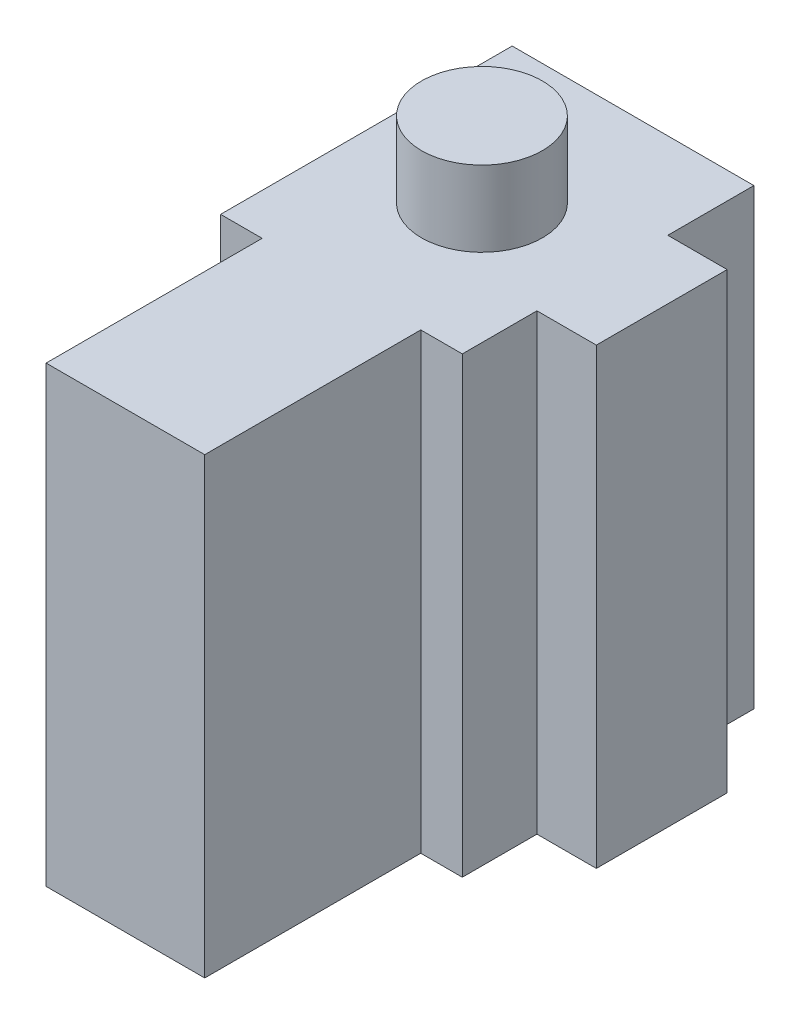
ISO-10303-21;
HEADER;
FILE_DESCRIPTION(('STEP AP214'),'2;1');
FILE_NAME('part.step','',(''),(''),'','','');
FILE_SCHEMA(('AUTOMOTIVE_DESIGN { 1 0 10303 214 1 1 1 1 }'));
ENDSEC;
DATA;
#1=APPLICATION_CONTEXT('core data for automotive mechanical design processes');
#2=APPLICATION_PROTOCOL_DEFINITION('international standard','automotive_design',2000,#1);
#3=PRODUCT_CONTEXT('',#1,'mechanical');
#4=PRODUCT('Part','Part','',(#3));
#5=PRODUCT_RELATED_PRODUCT_CATEGORY('part','',(#4));
#6=PRODUCT_DEFINITION_FORMATION('','',#4);
#7=PRODUCT_DEFINITION_CONTEXT('part definition',#1,'design');
#8=PRODUCT_DEFINITION('design','',#6,#7);
#9=PRODUCT_DEFINITION_SHAPE('','',#8);
#10=(LENGTH_UNIT() NAMED_UNIT(*) SI_UNIT(.MILLI.,.METRE.));
#11=(NAMED_UNIT(*) PLANE_ANGLE_UNIT() SI_UNIT($,.RADIAN.));
#12=(NAMED_UNIT(*) SI_UNIT($,.STERADIAN.) SOLID_ANGLE_UNIT());
#13=UNCERTAINTY_MEASURE_WITH_UNIT(LENGTH_MEASURE(1.E-05),#10,'distance_accuracy_value','');
#14=(GEOMETRIC_REPRESENTATION_CONTEXT(3) GLOBAL_UNCERTAINTY_ASSIGNED_CONTEXT((#13)) GLOBAL_UNIT_ASSIGNED_CONTEXT((#10,
#11,#12)) REPRESENTATION_CONTEXT('',''));
#15=CARTESIAN_POINT('',(0.,0.,0.));
#16=DIRECTION('',(0.,0.,1.));
#17=DIRECTION('',(1.,0.,0.));
#18=AXIS2_PLACEMENT_3D('',#15,#16,#17);
#19=CARTESIAN_POINT('',(0.,7.62,0.));
#20=DIRECTION('',(-1.,0.,0.));
#21=DIRECTION('',(0.,0.,1.));
#22=AXIS2_PLACEMENT_3D('',#19,#20,#21);
#23=PLANE('',#22);
#24=DIRECTION('',(0.,0.,-1.));
#25=VECTOR('',#24,1.);
#26=CARTESIAN_POINT('',(0.,0.,0.));
#27=LINE('',#26,#25);
#28=CARTESIAN_POINT('',(0.,0.,1.95115935074606));
#29=VERTEX_POINT('',#28);
#30=CARTESIAN_POINT('',(0.,0.,-1.68104064925394));
#31=VERTEX_POINT('',#30);
#32=EDGE_CURVE('E155',#29,#31,#27,.T.);
#33=ORIENTED_EDGE('',*,*,#32,.F.);
#34=DIRECTION('',(0.,-1.,0.));
#35=VECTOR('',#34,1.);
#36=CARTESIAN_POINT('',(0.,7.62,1.95115935074606));
#37=LINE('',#36,#35);
#38=CARTESIAN_POINT('',(0.,7.62,1.95115935074606));
#39=VERTEX_POINT('',#38);
#40=EDGE_CURVE('E11',#39,#29,#37,.T.);
#41=ORIENTED_EDGE('',*,*,#40,.F.);
#42=DIRECTION('',(0.,0.,-1.));
#43=VECTOR('',#42,1.);
#44=CARTESIAN_POINT('',(0.,7.62,0.));
#45=LINE('',#44,#43);
#46=CARTESIAN_POINT('',(0.,7.62,-1.68104064925394));
#47=VERTEX_POINT('',#46);
#48=EDGE_CURVE('E188',#39,#47,#45,.T.);
#49=ORIENTED_EDGE('',*,*,#48,.T.);
#50=DIRECTION('',(0.,-1.,0.));
#51=VECTOR('',#50,1.);
#52=CARTESIAN_POINT('',(0.,7.62,-1.68104064925394));
#53=LINE('',#52,#51);
#54=EDGE_CURVE('E54',#47,#31,#53,.T.);
#55=ORIENTED_EDGE('',*,*,#54,.T.);
#56=EDGE_LOOP('',(#33,#41,#49,#55));
#57=FACE_BOUND('',#56,.T.);
#58=ADVANCED_FACE('F38',(#57),#23,.T.);
#59=CARTESIAN_POINT('',(0.,7.62,1.95115935074606));
#60=DIRECTION('',(0.,0.,1.));
#61=DIRECTION('',(1.,0.,0.));
#62=AXIS2_PLACEMENT_3D('',#59,#60,#61);
#63=PLANE('',#62);
#64=DIRECTION('',(-1.,0.,0.));
#65=VECTOR('',#64,1.);
#66=CARTESIAN_POINT('',(0.,0.,1.95115935074606));
#67=LINE('',#66,#65);
#68=CARTESIAN_POINT('',(2.667,0.,1.95115935074606));
#69=VERTEX_POINT('',#68);
#70=EDGE_CURVE('E157',#69,#29,#67,.T.);
#71=ORIENTED_EDGE('',*,*,#70,.F.);
#72=DIRECTION('',(0.,-1.,0.));
#73=VECTOR('',#72,1.);
#74=CARTESIAN_POINT('',(2.667,7.62,1.95115935074606));
#75=LINE('',#74,#73);
#76=CARTESIAN_POINT('',(2.667,7.62,1.95115935074606));
#77=VERTEX_POINT('',#76);
#78=EDGE_CURVE('E46',#77,#69,#75,.T.);
#79=ORIENTED_EDGE('',*,*,#78,.F.);
#80=DIRECTION('',(-1.,0.,0.));
#81=VECTOR('',#80,1.);
#82=CARTESIAN_POINT('',(0.,7.62,1.95115935074606));
#83=LINE('',#82,#81);
#84=EDGE_CURVE('E225',#77,#39,#83,.T.);
#85=ORIENTED_EDGE('',*,*,#84,.T.);
#86=ORIENTED_EDGE('',*,*,#40,.T.);
#87=EDGE_LOOP('',(#71,#79,#85,#86));
#88=FACE_BOUND('',#87,.T.);
#89=ADVANCED_FACE('F213',(#88),#63,.T.);
#90=CARTESIAN_POINT('',(2.667,7.62,0.));
#91=DIRECTION('',(1.,0.,0.));
#92=DIRECTION('',(0.,0.,-1.));
#93=AXIS2_PLACEMENT_3D('',#90,#91,#92);
#94=PLANE('',#93);
#95=DIRECTION('',(0.,0.,1.));
#96=VECTOR('',#95,1.);
#97=CARTESIAN_POINT('',(2.667,0.,0.));
#98=LINE('',#97,#96);
#99=CARTESIAN_POINT('',(2.667,0.,-1.68104064925394));
#100=VERTEX_POINT('',#99);
#101=EDGE_CURVE('E161',#100,#69,#98,.T.);
#102=ORIENTED_EDGE('',*,*,#101,.F.);
#103=DIRECTION('',(0.,-1.,0.));
#104=VECTOR('',#103,1.);
#105=CARTESIAN_POINT('',(2.667,7.62,-1.68104064925394));
#106=LINE('',#105,#104);
#107=CARTESIAN_POINT('',(2.667,7.62,-1.68104064925394));
#108=VERTEX_POINT('',#107);
#109=EDGE_CURVE('E202',#108,#100,#106,.T.);
#110=ORIENTED_EDGE('',*,*,#109,.F.);
#111=DIRECTION('',(0.,0.,1.));
#112=VECTOR('',#111,1.);
#113=CARTESIAN_POINT('',(2.667,7.62,0.));
#114=LINE('',#113,#112);
#115=EDGE_CURVE('E209',#108,#77,#114,.T.);
#116=ORIENTED_EDGE('',*,*,#115,.T.);
#117=ORIENTED_EDGE('',*,*,#78,.T.);
#118=EDGE_LOOP('',(#102,#110,#116,#117));
#119=FACE_BOUND('',#118,.T.);
#120=ADVANCED_FACE('F207',(#119),#94,.T.);
#121=CARTESIAN_POINT('',(0.,7.62,-1.68104064925394));
#122=DIRECTION('',(0.,0.,1.));
#123=DIRECTION('',(1.,0.,0.));
#124=AXIS2_PLACEMENT_3D('',#121,#122,#123);
#125=PLANE('',#124);
#126=DIRECTION('',(-1.,0.,0.));
#127=VECTOR('',#126,1.);
#128=CARTESIAN_POINT('',(0.,0.,-1.68104064925394));
#129=LINE('',#128,#127);
#130=CARTESIAN_POINT('',(3.3655,0.,-1.68104064925394));
#131=VERTEX_POINT('',#130);
#132=EDGE_CURVE('E164',#131,#100,#129,.T.);
#133=ORIENTED_EDGE('',*,*,#132,.F.);
#134=DIRECTION('',(0.,-1.,0.));
#135=VECTOR('',#134,1.);
#136=CARTESIAN_POINT('',(3.3655,7.62,-1.68104064925394));
#137=LINE('',#136,#135);
#138=CARTESIAN_POINT('',(3.3655,7.62,-1.68104064925394));
#139=VERTEX_POINT('',#138);
#140=EDGE_CURVE('E200',#139,#131,#137,.T.);
#141=ORIENTED_EDGE('',*,*,#140,.F.);
#142=DIRECTION('',(-1.,0.,0.));
#143=VECTOR('',#142,1.);
#144=CARTESIAN_POINT('',(0.,7.62,-1.68104064925394));
#145=LINE('',#144,#143);
#146=EDGE_CURVE('E222',#139,#108,#145,.T.);
#147=ORIENTED_EDGE('',*,*,#146,.T.);
#148=ORIENTED_EDGE('',*,*,#109,.T.);
#149=EDGE_LOOP('',(#133,#141,#147,#148));
#150=FACE_BOUND('',#149,.T.);
#151=ADVANCED_FACE('F219',(#150),#125,.T.);
#152=CARTESIAN_POINT('',(3.3655,7.62,0.));
#153=DIRECTION('',(1.,0.,0.));
#154=DIRECTION('',(0.,0.,-1.));
#155=AXIS2_PLACEMENT_3D('',#152,#153,#154);
#156=PLANE('',#155);
#157=DIRECTION('',(0.,0.,1.));
#158=VECTOR('',#157,1.);
#159=CARTESIAN_POINT('',(3.3655,0.,0.));
#160=LINE('',#159,#158);
#161=CARTESIAN_POINT('',(3.3655,0.,-2.93580064925394));
#162=VERTEX_POINT('',#161);
#163=EDGE_CURVE('E167',#162,#131,#160,.T.);
#164=ORIENTED_EDGE('',*,*,#163,.F.);
#165=DIRECTION('',(0.,-1.,0.));
#166=VECTOR('',#165,1.);
#167=CARTESIAN_POINT('',(3.3655,7.62,-2.93580064925394));
#168=LINE('',#167,#166);
#169=CARTESIAN_POINT('',(3.3655,7.62,-2.93580064925394));
#170=VERTEX_POINT('',#169);
#171=EDGE_CURVE('E198',#170,#162,#168,.T.);
#172=ORIENTED_EDGE('',*,*,#171,.F.);
#173=DIRECTION('',(0.,0.,1.));
#174=VECTOR('',#173,1.);
#175=CARTESIAN_POINT('',(3.3655,7.62,0.));
#176=LINE('',#175,#174);
#177=EDGE_CURVE('E227',#170,#139,#176,.T.);
#178=ORIENTED_EDGE('',*,*,#177,.T.);
#179=ORIENTED_EDGE('',*,*,#140,.T.);
#180=EDGE_LOOP('',(#164,#172,#178,#179));
#181=FACE_BOUND('',#180,.T.);
#182=ADVANCED_FACE('F267',(#181),#156,.T.);
#183=CARTESIAN_POINT('',(0.,7.62,-2.93580064925393));
#184=DIRECTION('',(0.,0.,1.));
#185=DIRECTION('',(1.,0.,0.));
#186=AXIS2_PLACEMENT_3D('',#183,#184,#185);
#187=PLANE('',#186);
#188=DIRECTION('',(-1.,0.,0.));
#189=VECTOR('',#188,1.);
#190=CARTESIAN_POINT('',(0.,0.,-2.93580064925393));
#191=LINE('',#190,#189);
#192=CARTESIAN_POINT('',(4.36372,0.,-2.93580064925394));
#193=VERTEX_POINT('',#192);
#194=EDGE_CURVE('E170',#193,#162,#191,.T.);
#195=ORIENTED_EDGE('',*,*,#194,.F.);
#196=DIRECTION('',(0.,-1.,0.));
#197=VECTOR('',#196,1.);
#198=CARTESIAN_POINT('',(4.36372,7.62,-2.93580064925394));
#199=LINE('',#198,#197);
#200=CARTESIAN_POINT('',(4.36372,7.62,-2.93580064925394));
#201=VERTEX_POINT('',#200);
#202=EDGE_CURVE('E196',#201,#193,#199,.T.);
#203=ORIENTED_EDGE('',*,*,#202,.F.);
#204=DIRECTION('',(-1.,0.,0.));
#205=VECTOR('',#204,1.);
#206=CARTESIAN_POINT('',(0.,7.62,-2.93580064925393));
#207=LINE('',#206,#205);
#208=EDGE_CURVE('E233',#201,#170,#207,.T.);
#209=ORIENTED_EDGE('',*,*,#208,.T.);
#210=ORIENTED_EDGE('',*,*,#171,.T.);
#211=EDGE_LOOP('',(#195,#203,#209,#210));
#212=FACE_BOUND('',#211,.T.);
#213=ADVANCED_FACE('F270',(#212),#187,.T.);
#214=CARTESIAN_POINT('',(4.36372,7.62,0.));
#215=DIRECTION('',(1.,0.,0.));
#216=DIRECTION('',(0.,0.,-1.));
#217=AXIS2_PLACEMENT_3D('',#214,#215,#216);
#218=PLANE('',#217);
#219=DIRECTION('',(0.,0.,1.));
#220=VECTOR('',#219,1.);
#221=CARTESIAN_POINT('',(4.36372,0.,0.));
#222=LINE('',#221,#220);
#223=CARTESIAN_POINT('',(4.36372,0.,-5.13544064925394));
#224=VERTEX_POINT('',#223);
#225=EDGE_CURVE('E173',#224,#193,#222,.T.);
#226=ORIENTED_EDGE('',*,*,#225,.F.);
#227=DIRECTION('',(0.,-1.,0.));
#228=VECTOR('',#227,1.);
#229=CARTESIAN_POINT('',(4.36372,7.62,-5.13544064925394));
#230=LINE('',#229,#228);
#231=CARTESIAN_POINT('',(4.36372,7.62,-5.13544064925394));
#232=VERTEX_POINT('',#231);
#233=EDGE_CURVE('E194',#232,#224,#230,.T.);
#234=ORIENTED_EDGE('',*,*,#233,.F.);
#235=DIRECTION('',(0.,0.,1.));
#236=VECTOR('',#235,1.);
#237=CARTESIAN_POINT('',(4.36372,7.62,0.));
#238=LINE('',#237,#236);
#239=EDGE_CURVE('E236',#232,#201,#238,.T.);
#240=ORIENTED_EDGE('',*,*,#239,.T.);
#241=ORIENTED_EDGE('',*,*,#202,.T.);
#242=EDGE_LOOP('',(#226,#234,#240,#241));
#243=FACE_BOUND('',#242,.T.);
#244=ADVANCED_FACE('F274',(#243),#218,.T.);
#245=CARTESIAN_POINT('',(0.,7.62,-5.13544064925393));
#246=DIRECTION('',(0.,0.,-1.));
#247=DIRECTION('',(-1.,0.,0.));
#248=AXIS2_PLACEMENT_3D('',#245,#246,#247);
#249=PLANE('',#248);
#250=DIRECTION('',(1.,0.,0.));
#251=VECTOR('',#250,1.);
#252=CARTESIAN_POINT('',(0.,0.,-5.13544064925393));
#253=LINE('',#252,#251);
#254=CARTESIAN_POINT('',(3.3655,0.,-5.13544064925394));
#255=VERTEX_POINT('',#254);
#256=EDGE_CURVE('E176',#255,#224,#253,.T.);
#257=ORIENTED_EDGE('',*,*,#256,.F.);
#258=DIRECTION('',(0.,-1.,0.));
#259=VECTOR('',#258,1.);
#260=CARTESIAN_POINT('',(3.3655,7.62,-5.13544064925394));
#261=LINE('',#260,#259);
#262=CARTESIAN_POINT('',(3.3655,7.62,-5.13544064925394));
#263=VERTEX_POINT('',#262);
#264=EDGE_CURVE('E192',#263,#255,#261,.T.);
#265=ORIENTED_EDGE('',*,*,#264,.F.);
#266=DIRECTION('',(1.,0.,0.));
#267=VECTOR('',#266,1.);
#268=CARTESIAN_POINT('',(0.,7.62,-5.13544064925393));
#269=LINE('',#268,#267);
#270=EDGE_CURVE('E239',#263,#232,#269,.T.);
#271=ORIENTED_EDGE('',*,*,#270,.T.);
#272=ORIENTED_EDGE('',*,*,#233,.T.);
#273=EDGE_LOOP('',(#257,#265,#271,#272));
#274=FACE_BOUND('',#273,.T.);
#275=ADVANCED_FACE('F278',(#274),#249,.T.);
#276=CARTESIAN_POINT('',(3.3655,7.62,0.));
#277=DIRECTION('',(1.,0.,0.));
#278=DIRECTION('',(0.,0.,-1.));
#279=AXIS2_PLACEMENT_3D('',#276,#277,#278);
#280=PLANE('',#279);
#281=DIRECTION('',(0.,0.,1.));
#282=VECTOR('',#281,1.);
#283=CARTESIAN_POINT('',(3.3655,0.,0.));
#284=LINE('',#283,#282);
#285=CARTESIAN_POINT('',(3.3655,0.,-6.58324064925394));
#286=VERTEX_POINT('',#285);
#287=EDGE_CURVE('E179',#286,#255,#284,.T.);
#288=ORIENTED_EDGE('',*,*,#287,.F.);
#289=DIRECTION('',(0.,-1.,0.));
#290=VECTOR('',#289,1.);
#291=CARTESIAN_POINT('',(3.3655,7.62,-6.58324064925394));
#292=LINE('',#291,#290);
#293=CARTESIAN_POINT('',(3.3655,7.62,-6.58324064925394));
#294=VERTEX_POINT('',#293);
#295=EDGE_CURVE('E137',#294,#286,#292,.T.);
#296=ORIENTED_EDGE('',*,*,#295,.F.);
#297=DIRECTION('',(0.,0.,1.));
#298=VECTOR('',#297,1.);
#299=CARTESIAN_POINT('',(3.3655,7.62,0.));
#300=LINE('',#299,#298);
#301=EDGE_CURVE('E147',#294,#263,#300,.T.);
#302=ORIENTED_EDGE('',*,*,#301,.T.);
#303=ORIENTED_EDGE('',*,*,#264,.T.);
#304=EDGE_LOOP('',(#288,#296,#302,#303));
#305=FACE_BOUND('',#304,.T.);
#306=ADVANCED_FACE('F243',(#305),#280,.T.);
#307=CARTESIAN_POINT('',(0.,7.62,-6.58324064925394));
#308=DIRECTION('',(0.,0.,-1.));
#309=DIRECTION('',(-1.,0.,0.));
#310=AXIS2_PLACEMENT_3D('',#307,#308,#309);
#311=PLANE('',#310);
#312=DIRECTION('',(1.,0.,0.));
#313=VECTOR('',#312,1.);
#314=CARTESIAN_POINT('',(0.,0.,-6.58324064925394));
#315=LINE('',#314,#313);
#316=CARTESIAN_POINT('',(-0.6985,0.,-6.58324064925394));
#317=VERTEX_POINT('',#316);
#318=EDGE_CURVE('E133',#317,#286,#315,.T.);
#319=ORIENTED_EDGE('',*,*,#318,.F.);
#320=DIRECTION('',(0.,-1.,0.));
#321=VECTOR('',#320,1.);
#322=CARTESIAN_POINT('',(-0.6985,7.62,-6.58324064925394));
#323=LINE('',#322,#321);
#324=CARTESIAN_POINT('',(-0.6985,7.62,-6.58324064925394));
#325=VERTEX_POINT('',#324);
#326=EDGE_CURVE('E128',#325,#317,#323,.T.);
#327=ORIENTED_EDGE('',*,*,#326,.F.);
#328=DIRECTION('',(1.,0.,0.));
#329=VECTOR('',#328,1.);
#330=CARTESIAN_POINT('',(0.,7.62,-6.58324064925394));
#331=LINE('',#330,#329);
#332=EDGE_CURVE('E131',#325,#294,#331,.T.);
#333=ORIENTED_EDGE('',*,*,#332,.T.);
#334=ORIENTED_EDGE('',*,*,#295,.T.);
#335=EDGE_LOOP('',(#319,#327,#333,#334));
#336=FACE_BOUND('',#335,.T.);
#337=ADVANCED_FACE('F130',(#336),#311,.T.);
#338=CARTESIAN_POINT('',(-0.6985,7.62,0.));
#339=DIRECTION('',(-1.,0.,0.));
#340=DIRECTION('',(0.,0.,1.));
#341=AXIS2_PLACEMENT_3D('',#338,#339,#340);
#342=PLANE('',#341);
#343=DIRECTION('',(0.,0.,-1.));
#344=VECTOR('',#343,1.);
#345=CARTESIAN_POINT('',(-0.6985,0.,0.));
#346=LINE('',#345,#344);
#347=CARTESIAN_POINT('',(-0.6985,0.,-1.68104064925394));
#348=VERTEX_POINT('',#347);
#349=EDGE_CURVE('E183',#348,#317,#346,.T.);
#350=ORIENTED_EDGE('',*,*,#349,.F.);
#351=DIRECTION('',(0.,-1.,0.));
#352=VECTOR('',#351,1.);
#353=CARTESIAN_POINT('',(-0.6985,7.62,-1.68104064925394));
#354=LINE('',#353,#352);
#355=CARTESIAN_POINT('',(-0.6985,7.62,-1.68104064925394));
#356=VERTEX_POINT('',#355);
#357=EDGE_CURVE('E91',#356,#348,#354,.T.);
#358=ORIENTED_EDGE('',*,*,#357,.F.);
#359=DIRECTION('',(0.,0.,-1.));
#360=VECTOR('',#359,1.);
#361=CARTESIAN_POINT('',(-0.6985,7.62,0.));
#362=LINE('',#361,#360);
#363=EDGE_CURVE('E144',#356,#325,#362,.T.);
#364=ORIENTED_EDGE('',*,*,#363,.T.);
#365=ORIENTED_EDGE('',*,*,#326,.T.);
#366=EDGE_LOOP('',(#350,#358,#364,#365));
#367=FACE_BOUND('',#366,.T.);
#368=ADVANCED_FACE('F149',(#367),#342,.T.);
#369=CARTESIAN_POINT('',(0.,7.62,-1.68104064925394));
#370=DIRECTION('',(0.,0.,1.));
#371=DIRECTION('',(1.,0.,0.));
#372=AXIS2_PLACEMENT_3D('',#369,#370,#371);
#373=PLANE('',#372);
#374=DIRECTION('',(-1.,0.,0.));
#375=VECTOR('',#374,1.);
#376=CARTESIAN_POINT('',(0.,0.,-1.68104064925394));
#377=LINE('',#376,#375);
#378=EDGE_CURVE('E185',#31,#348,#377,.T.);
#379=ORIENTED_EDGE('',*,*,#378,.F.);
#380=ORIENTED_EDGE('',*,*,#54,.F.);
#381=DIRECTION('',(-1.,0.,0.));
#382=VECTOR('',#381,1.);
#383=CARTESIAN_POINT('',(0.,7.62,-1.68104064925394));
#384=LINE('',#383,#382);
#385=EDGE_CURVE('E150',#47,#356,#384,.T.);
#386=ORIENTED_EDGE('',*,*,#385,.T.);
#387=ORIENTED_EDGE('',*,*,#357,.T.);
#388=EDGE_LOOP('',(#379,#380,#386,#387));
#389=FACE_BOUND('',#388,.T.);
#390=ADVANCED_FACE('F245',(#389),#373,.T.);
#391=CARTESIAN_POINT('',(0.,7.62,0.));
#392=DIRECTION('',(0.,1.,0.));
#393=DIRECTION('',(0.,0.,1.));
#394=AXIS2_PLACEMENT_3D('',#391,#392,#393);
#395=PLANE('',#394);
#396=CARTESIAN_POINT('',(1.3335,7.62,-4.04324064925394));
#397=DIRECTION('',(0.,1.,0.));
#398=DIRECTION('',(0.,0.,1.));
#399=AXIS2_PLACEMENT_3D('',#396,#397,#398);
#400=CIRCLE('',#399,1.016);
#401=CARTESIAN_POINT('',(1.3335,7.62,-3.02724064925394));
#402=VERTEX_POINT('',#401);
#403=EDGE_CURVE('E337',#402,#402,#400,.T.);
#404=ORIENTED_EDGE('',*,*,#403,.F.);
#405=EDGE_LOOP('',(#404));
#406=FACE_BOUND('',#405,.T.);
#407=ORIENTED_EDGE('',*,*,#48,.F.);
#408=ORIENTED_EDGE('',*,*,#84,.F.);
#409=ORIENTED_EDGE('',*,*,#115,.F.);
#410=ORIENTED_EDGE('',*,*,#146,.F.);
#411=ORIENTED_EDGE('',*,*,#177,.F.);
#412=ORIENTED_EDGE('',*,*,#208,.F.);
#413=ORIENTED_EDGE('',*,*,#239,.F.);
#414=ORIENTED_EDGE('',*,*,#270,.F.);
#415=ORIENTED_EDGE('',*,*,#301,.F.);
#416=ORIENTED_EDGE('',*,*,#332,.F.);
#417=ORIENTED_EDGE('',*,*,#363,.F.);
#418=ORIENTED_EDGE('',*,*,#385,.F.);
#419=EDGE_LOOP('',(#407,#408,#409,#410,#411,#412,#413,#414,#415,#416,#417,#418));
#420=FACE_BOUND('',#419,.T.);
#421=ADVANCED_FACE('F142',(#406,#420),#395,.T.);
#422=CARTESIAN_POINT('',(0.,0.,0.));
#423=DIRECTION('',(0.,1.,0.));
#424=DIRECTION('',(0.,0.,1.));
#425=AXIS2_PLACEMENT_3D('',#422,#423,#424);
#426=PLANE('',#425);
#427=ORIENTED_EDGE('',*,*,#32,.T.);
#428=ORIENTED_EDGE('',*,*,#378,.T.);
#429=ORIENTED_EDGE('',*,*,#349,.T.);
#430=ORIENTED_EDGE('',*,*,#318,.T.);
#431=ORIENTED_EDGE('',*,*,#287,.T.);
#432=ORIENTED_EDGE('',*,*,#256,.T.);
#433=ORIENTED_EDGE('',*,*,#225,.T.);
#434=ORIENTED_EDGE('',*,*,#194,.T.);
#435=ORIENTED_EDGE('',*,*,#163,.T.);
#436=ORIENTED_EDGE('',*,*,#132,.T.);
#437=ORIENTED_EDGE('',*,*,#101,.T.);
#438=ORIENTED_EDGE('',*,*,#70,.T.);
#439=EDGE_LOOP('',(#427,#428,#429,#430,#431,#432,#433,#434,#435,#436,#437,#438));
#440=FACE_BOUND('',#439,.T.);
#441=ADVANCED_FACE('F215',(#440),#426,.F.);
#442=CARTESIAN_POINT('',(1.3335,8.89,-4.04324064925394));
#443=DIRECTION('',(0.,-1.,0.));
#444=DIRECTION('',(0.,0.,-1.));
#445=AXIS2_PLACEMENT_3D('',#442,#443,#444);
#446=CYLINDRICAL_SURFACE('',#445,1.016);
#447=CARTESIAN_POINT('',(1.3335,8.89,-4.04324064925394));
#448=DIRECTION('',(0.,1.,0.));
#449=DIRECTION('',(0.,0.,1.));
#450=AXIS2_PLACEMENT_3D('',#447,#448,#449);
#451=CIRCLE('',#450,1.016);
#452=CARTESIAN_POINT('',(1.3335,8.89,-3.02724064925394));
#453=VERTEX_POINT('',#452);
#454=EDGE_CURVE('E158',#453,#453,#451,.T.);
#455=ORIENTED_EDGE('',*,*,#454,.F.);
#456=EDGE_LOOP('',(#455));
#457=FACE_BOUND('',#456,.T.);
#458=ORIENTED_EDGE('',*,*,#403,.T.);
#459=EDGE_LOOP('',(#458));
#460=FACE_BOUND('',#459,.T.);
#461=ADVANCED_FACE('F308',(#457,#460),#446,.T.);
#462=CARTESIAN_POINT('',(1.3335,8.89,-4.04324064925394));
#463=DIRECTION('',(0.,1.,0.));
#464=DIRECTION('',(0.,0.,1.));
#465=AXIS2_PLACEMENT_3D('',#462,#463,#464);
#466=PLANE('',#465);
#467=ORIENTED_EDGE('',*,*,#454,.T.);
#468=EDGE_LOOP('',(#467));
#469=FACE_BOUND('',#468,.T.);
#470=ADVANCED_FACE('F321',(#469),#466,.T.);
#471=CLOSED_SHELL('',(#58,#89,#120,#151,#182,#213,#244,#275,#306,#337,#368,#390,#421,#441,#461,#470));
#472=MANIFOLD_SOLID_BREP('B2',#471);
#473=ADVANCED_BREP_SHAPE_REPRESENTATION('',(#18,#472),#14);
#474=SHAPE_DEFINITION_REPRESENTATION(#9,#473);
ENDSEC;
END-ISO-10303-21;
